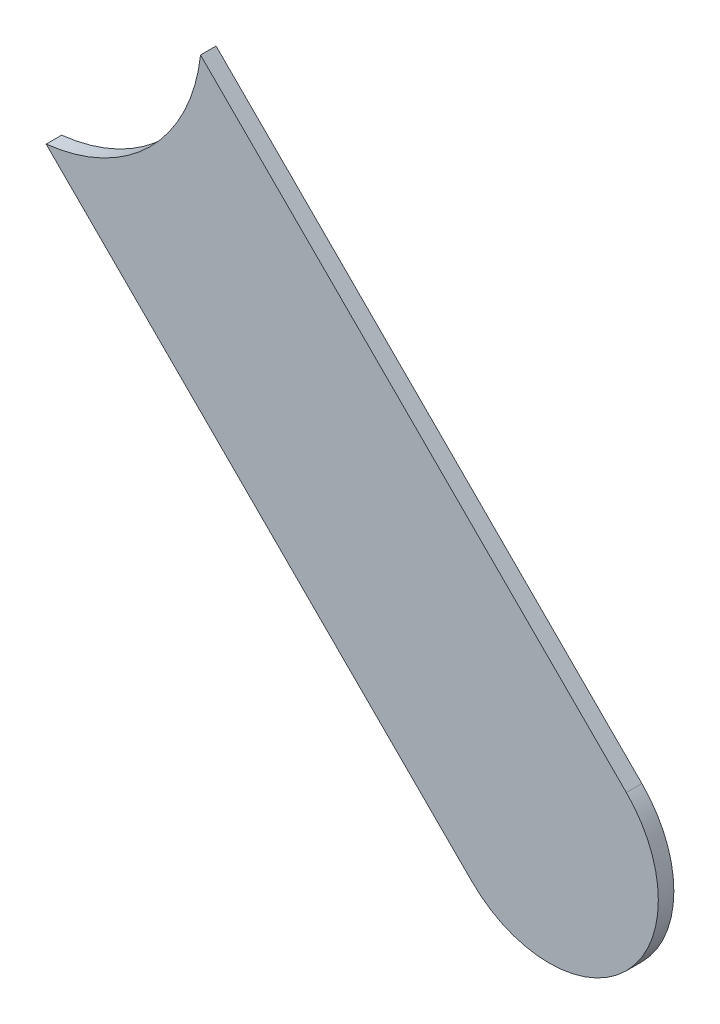
ISO-10303-21;
HEADER;
FILE_DESCRIPTION(('STEP AP214'),'2;1');
FILE_NAME('part.step','',(''),(''),'','','');
FILE_SCHEMA(('AUTOMOTIVE_DESIGN { 1 0 10303 214 1 1 1 1 }'));
ENDSEC;
DATA;
#1=APPLICATION_CONTEXT('core data for automotive mechanical design processes');
#2=APPLICATION_PROTOCOL_DEFINITION('international standard','automotive_design',2000,#1);
#3=PRODUCT_CONTEXT('',#1,'mechanical');
#4=PRODUCT('Part','Part','',(#3));
#5=PRODUCT_RELATED_PRODUCT_CATEGORY('part','',(#4));
#6=PRODUCT_DEFINITION_FORMATION('','',#4);
#7=PRODUCT_DEFINITION_CONTEXT('part definition',#1,'design');
#8=PRODUCT_DEFINITION('design','',#6,#7);
#9=PRODUCT_DEFINITION_SHAPE('','',#8);
#10=(LENGTH_UNIT() NAMED_UNIT(*) SI_UNIT(.MILLI.,.METRE.));
#11=(NAMED_UNIT(*) PLANE_ANGLE_UNIT() SI_UNIT($,.RADIAN.));
#12=(NAMED_UNIT(*) SI_UNIT($,.STERADIAN.) SOLID_ANGLE_UNIT());
#13=UNCERTAINTY_MEASURE_WITH_UNIT(LENGTH_MEASURE(1.E-05),#10,'distance_accuracy_value','');
#14=(GEOMETRIC_REPRESENTATION_CONTEXT(3) GLOBAL_UNCERTAINTY_ASSIGNED_CONTEXT((#13)) GLOBAL_UNIT_ASSIGNED_CONTEXT((#10,
#11,#12)) REPRESENTATION_CONTEXT('',''));
#15=CARTESIAN_POINT('',(0.,0.,0.));
#16=DIRECTION('',(0.,0.,1.));
#17=DIRECTION('',(1.,0.,0.));
#18=AXIS2_PLACEMENT_3D('',#15,#16,#17);
#19=CARTESIAN_POINT('',(85.7540311694402,103.87242727056,0.));
#20=DIRECTION('',(0.707106781186552,0.707106781186543,0.));
#21=DIRECTION('',(0.707106781186543,-0.707106781186552,0.));
#22=AXIS2_PLACEMENT_3D('',#19,#20,#21);
#23=PLANE('',#22);
#24=DIRECTION('',(0.707106781186543,-0.707106781186552,0.));
#25=VECTOR('',#24,1.);
#26=CARTESIAN_POINT('',(85.53323762,104.09322082,0.03556));
#27=LINE('',#26,#25);
#28=CARTESIAN_POINT('',(85.7540311694402,103.87242727056,0.03556));
#29=VERTEX_POINT('',#28);
#30=CARTESIAN_POINT('',(86.72922456,102.89723388,0.03556));
#31=VERTEX_POINT('',#30);
#32=EDGE_CURVE('E11',#29,#31,#27,.T.);
#33=ORIENTED_EDGE('',*,*,#32,.F.);
#34=DIRECTION('',(0.,0.,1.));
#35=VECTOR('',#34,1.);
#36=CARTESIAN_POINT('',(85.7540311694402,103.87242727056,0.));
#37=LINE('',#36,#35);
#38=CARTESIAN_POINT('',(85.7540311694402,103.87242727056,0.));
#39=VERTEX_POINT('',#38);
#40=EDGE_CURVE('E24',#39,#29,#37,.T.);
#41=ORIENTED_EDGE('',*,*,#40,.F.);
#42=DIRECTION('',(0.707106781186543,-0.707106781186552,0.));
#43=VECTOR('',#42,1.);
#44=CARTESIAN_POINT('',(85.53323762,104.09322082,0.));
#45=LINE('',#44,#43);
#46=CARTESIAN_POINT('',(86.72922456,102.89723388,0.));
#47=VERTEX_POINT('',#46);
#48=EDGE_CURVE('E75',#39,#47,#45,.T.);
#49=ORIENTED_EDGE('',*,*,#48,.T.);
#50=DIRECTION('',(0.,0.,1.));
#51=VECTOR('',#50,1.);
#52=CARTESIAN_POINT('',(86.72922456,102.89723388,0.));
#53=LINE('',#52,#51);
#54=EDGE_CURVE('E37',#47,#31,#53,.T.);
#55=ORIENTED_EDGE('',*,*,#54,.T.);
#56=EDGE_LOOP('',(#33,#41,#49,#55));
#57=FACE_BOUND('',#56,.T.);
#58=ADVANCED_FACE('F17',(#57),#23,.F.);
#59=CARTESIAN_POINT('',(86.90600094,103.07401026,0.));
#60=DIRECTION('',(0.,0.,-1.));
#61=DIRECTION('',(-0.707106781186519,-0.707106781186576,0.));
#62=AXIS2_PLACEMENT_3D('',#59,#60,#61);
#63=CYLINDRICAL_SURFACE('',#62,0.249999554103226);
#64=CARTESIAN_POINT('',(86.90600094,103.07401026,0.03556));
#65=DIRECTION('',(0.,0.,1.));
#66=DIRECTION('',(-0.707106781186519,-0.707106781186576,0.));
#67=AXIS2_PLACEMENT_3D('',#64,#65,#66);
#68=CIRCLE('',#67,0.249999554103226);
#69=CARTESIAN_POINT('',(87.08277732,103.25078664,0.03556));
#70=VERTEX_POINT('',#69);
#71=EDGE_CURVE('E83',#31,#70,#68,.T.);
#72=ORIENTED_EDGE('',*,*,#71,.F.);
#73=ORIENTED_EDGE('',*,*,#54,.F.);
#74=CARTESIAN_POINT('',(86.90600094,103.07401026,0.));
#75=DIRECTION('',(0.,0.,1.));
#76=DIRECTION('',(-0.707106781186519,-0.707106781186576,0.));
#77=AXIS2_PLACEMENT_3D('',#74,#75,#76);
#78=CIRCLE('',#77,0.249999554103226);
#79=CARTESIAN_POINT('',(87.08277732,103.25078664,0.));
#80=VERTEX_POINT('',#79);
#81=EDGE_CURVE('E81',#47,#80,#78,.T.);
#82=ORIENTED_EDGE('',*,*,#81,.T.);
#83=DIRECTION('',(0.,0.,1.));
#84=VECTOR('',#83,1.);
#85=CARTESIAN_POINT('',(87.08277732,103.25078664,0.));
#86=LINE('',#85,#84);
#87=EDGE_CURVE('E67',#80,#70,#86,.T.);
#88=ORIENTED_EDGE('',*,*,#87,.T.);
#89=EDGE_LOOP('',(#72,#73,#82,#88));
#90=FACE_BOUND('',#89,.T.);
#91=ADVANCED_FACE('F89',(#90),#63,.T.);
#92=CARTESIAN_POINT('',(87.08277732,103.25078664,0.));
#93=DIRECTION('',(-0.707106781186543,-0.707106781186552,0.));
#94=DIRECTION('',(-0.707106781186552,0.707106781186543,0.));
#95=AXIS2_PLACEMENT_3D('',#92,#93,#94);
#96=PLANE('',#95);
#97=DIRECTION('',(-0.707106781186552,0.707106781186543,0.));
#98=VECTOR('',#97,1.);
#99=CARTESIAN_POINT('',(87.08277732,103.25078664,0.03556));
#100=LINE('',#99,#98);
#101=CARTESIAN_POINT('',(86.1075839294403,104.22598003056,0.03556));
#102=VERTEX_POINT('',#101);
#103=EDGE_CURVE('E71',#70,#102,#100,.T.);
#104=ORIENTED_EDGE('',*,*,#103,.F.);
#105=ORIENTED_EDGE('',*,*,#87,.F.);
#106=DIRECTION('',(-0.707106781186552,0.707106781186543,0.));
#107=VECTOR('',#106,1.);
#108=CARTESIAN_POINT('',(87.08277732,103.25078664,0.));
#109=LINE('',#108,#107);
#110=CARTESIAN_POINT('',(86.1075839294403,104.22598003056,0.));
#111=VERTEX_POINT('',#110);
#112=EDGE_CURVE('E63',#80,#111,#109,.T.);
#113=ORIENTED_EDGE('',*,*,#112,.T.);
#114=DIRECTION('',(0.,0.,1.));
#115=VECTOR('',#114,1.);
#116=CARTESIAN_POINT('',(86.1075839294403,104.22598003056,0.));
#117=LINE('',#116,#115);
#118=EDGE_CURVE('E53',#111,#102,#117,.T.);
#119=ORIENTED_EDGE('',*,*,#118,.T.);
#120=EDGE_LOOP('',(#104,#105,#113,#119));
#121=FACE_BOUND('',#120,.T.);
#122=ADVANCED_FACE('F66',(#121),#96,.F.);
#123=CARTESIAN_POINT('',(85.710014,104.2699972,0.));
#124=DIRECTION('',(0.,0.,-1.));
#125=DIRECTION('',(1.,0.,0.));
#126=AXIS2_PLACEMENT_3D('',#123,#124,#125);
#127=CYLINDRICAL_SURFACE('',#126,0.3999992);
#128=ORIENTED_EDGE('',*,*,#40,.T.);
#129=CARTESIAN_POINT('',(85.710014,104.2699972,0.03556));
#130=DIRECTION('',(0.,0.,1.));
#131=DIRECTION('',(1.,0.,0.));
#132=AXIS2_PLACEMENT_3D('',#129,#130,#131);
#133=CIRCLE('',#132,0.3999992);
#134=EDGE_CURVE('E59',#29,#102,#133,.T.);
#135=ORIENTED_EDGE('',*,*,#134,.T.);
#136=ORIENTED_EDGE('',*,*,#118,.F.);
#137=CARTESIAN_POINT('',(85.710014,104.2699972,0.));
#138=DIRECTION('',(0.,0.,1.));
#139=DIRECTION('',(1.,0.,0.));
#140=AXIS2_PLACEMENT_3D('',#137,#138,#139);
#141=CIRCLE('',#140,0.3999992);
#142=EDGE_CURVE('E57',#39,#111,#141,.T.);
#143=ORIENTED_EDGE('',*,*,#142,.F.);
#144=EDGE_LOOP('',(#128,#135,#136,#143));
#145=FACE_BOUND('',#144,.T.);
#146=ADVANCED_FACE('F55',(#145),#127,.F.);
#147=CARTESIAN_POINT('',(85.53323762,104.09322082,0.));
#148=DIRECTION('',(0.,0.,-1.));
#149=DIRECTION('',(-1.,0.,0.));
#150=AXIS2_PLACEMENT_3D('',#147,#148,#149);
#151=PLANE('',#150);
#152=ORIENTED_EDGE('',*,*,#48,.F.);
#153=ORIENTED_EDGE('',*,*,#142,.T.);
#154=ORIENTED_EDGE('',*,*,#112,.F.);
#155=ORIENTED_EDGE('',*,*,#81,.F.);
#156=EDGE_LOOP('',(#152,#153,#154,#155));
#157=FACE_BOUND('',#156,.T.);
#158=ADVANCED_FACE('F74',(#157),#151,.T.);
#159=CARTESIAN_POINT('',(85.53323762,104.09322082,0.03556));
#160=DIRECTION('',(0.,0.,-1.));
#161=DIRECTION('',(-1.,0.,0.));
#162=AXIS2_PLACEMENT_3D('',#159,#160,#161);
#163=PLANE('',#162);
#164=ORIENTED_EDGE('',*,*,#134,.F.);
#165=ORIENTED_EDGE('',*,*,#32,.T.);
#166=ORIENTED_EDGE('',*,*,#71,.T.);
#167=ORIENTED_EDGE('',*,*,#103,.T.);
#168=EDGE_LOOP('',(#164,#165,#166,#167));
#169=FACE_BOUND('',#168,.T.);
#170=ADVANCED_FACE('F91',(#169),#163,.F.);
#171=CLOSED_SHELL('',(#58,#91,#122,#146,#158,#170));
#172=MANIFOLD_SOLID_BREP('B1',#171);
#173=ADVANCED_BREP_SHAPE_REPRESENTATION('',(#18,#172),#14);
#174=SHAPE_DEFINITION_REPRESENTATION(#9,#173);
ENDSEC;
END-ISO-10303-21;
